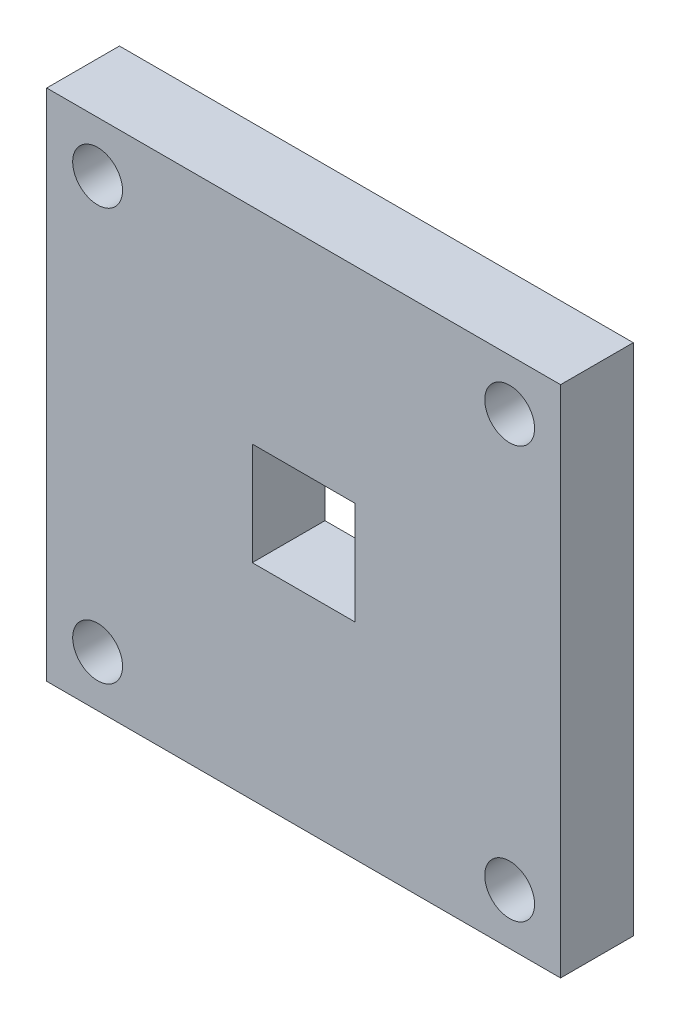
ISO-10303-21;
HEADER;
FILE_DESCRIPTION(('STEP AP214'),'2;1');
FILE_NAME('part.step','',(''),(''),'','','');
FILE_SCHEMA(('AUTOMOTIVE_DESIGN { 1 0 10303 214 1 1 1 1 }'));
ENDSEC;
DATA;
#1=APPLICATION_CONTEXT('core data for automotive mechanical design processes');
#2=APPLICATION_PROTOCOL_DEFINITION('international standard','automotive_design',2000,#1);
#3=PRODUCT_CONTEXT('',#1,'mechanical');
#4=PRODUCT('Part','Part','',(#3));
#5=PRODUCT_RELATED_PRODUCT_CATEGORY('part','',(#4));
#6=PRODUCT_DEFINITION_FORMATION('','',#4);
#7=PRODUCT_DEFINITION_CONTEXT('part definition',#1,'design');
#8=PRODUCT_DEFINITION('design','',#6,#7);
#9=PRODUCT_DEFINITION_SHAPE('','',#8);
#10=(LENGTH_UNIT() NAMED_UNIT(*) SI_UNIT(.MILLI.,.METRE.));
#11=(NAMED_UNIT(*) PLANE_ANGLE_UNIT() SI_UNIT($,.RADIAN.));
#12=(NAMED_UNIT(*) SI_UNIT($,.STERADIAN.) SOLID_ANGLE_UNIT());
#13=UNCERTAINTY_MEASURE_WITH_UNIT(LENGTH_MEASURE(1.E-05),#10,'distance_accuracy_value','');
#14=(GEOMETRIC_REPRESENTATION_CONTEXT(3) GLOBAL_UNCERTAINTY_ASSIGNED_CONTEXT((#13)) GLOBAL_UNIT_ASSIGNED_CONTEXT((#10,
#11,#12)) REPRESENTATION_CONTEXT('',''));
#15=CARTESIAN_POINT('',(0.,0.,0.));
#16=DIRECTION('',(0.,0.,1.));
#17=DIRECTION('',(1.,0.,0.));
#18=AXIS2_PLACEMENT_3D('',#15,#16,#17);
#19=CARTESIAN_POINT('',(16.8275,-16.8275,2.38125));
#20=DIRECTION('',(-1.,0.,0.));
#21=DIRECTION('',(0.,0.,1.));
#22=AXIS2_PLACEMENT_3D('',#19,#20,#21);
#23=PLANE('',#22);
#24=DIRECTION('',(0.,1.,0.));
#25=VECTOR('',#24,1.);
#26=CARTESIAN_POINT('',(16.8275,-16.8275,-2.38125));
#27=LINE('',#26,#25);
#28=CARTESIAN_POINT('',(16.8275,-16.8275,-2.38125));
#29=VERTEX_POINT('',#28);
#30=CARTESIAN_POINT('',(16.8275,16.8275,-2.38125));
#31=VERTEX_POINT('',#30);
#32=EDGE_CURVE('E104',#29,#31,#27,.T.);
#33=ORIENTED_EDGE('',*,*,#32,.T.);
#34=DIRECTION('',(0.,0.,-1.));
#35=VECTOR('',#34,1.);
#36=CARTESIAN_POINT('',(16.8275,16.8275,2.38125));
#37=LINE('',#36,#35);
#38=CARTESIAN_POINT('',(16.8275,16.8275,2.38125));
#39=VERTEX_POINT('',#38);
#40=EDGE_CURVE('E11',#39,#31,#37,.T.);
#41=ORIENTED_EDGE('',*,*,#40,.F.);
#42=DIRECTION('',(0.,1.,0.));
#43=VECTOR('',#42,1.);
#44=CARTESIAN_POINT('',(16.8275,-16.8275,2.38125));
#45=LINE('',#44,#43);
#46=CARTESIAN_POINT('',(16.8275,-16.8275,2.38125));
#47=VERTEX_POINT('',#46);
#48=EDGE_CURVE('E133',#47,#39,#45,.T.);
#49=ORIENTED_EDGE('',*,*,#48,.F.);
#50=DIRECTION('',(0.,0.,-1.));
#51=VECTOR('',#50,1.);
#52=CARTESIAN_POINT('',(16.8275,-16.8275,2.38125));
#53=LINE('',#52,#51);
#54=EDGE_CURVE('E143',#47,#29,#53,.T.);
#55=ORIENTED_EDGE('',*,*,#54,.T.);
#56=EDGE_LOOP('',(#33,#41,#49,#55));
#57=FACE_BOUND('',#56,.T.);
#58=ADVANCED_FACE('F34',(#57),#23,.F.);
#59=CARTESIAN_POINT('',(-16.8275,16.8275,2.38125));
#60=DIRECTION('',(0.,-1.,0.));
#61=DIRECTION('',(0.,0.,-1.));
#62=AXIS2_PLACEMENT_3D('',#59,#60,#61);
#63=PLANE('',#62);
#64=DIRECTION('',(-1.,0.,0.));
#65=VECTOR('',#64,1.);
#66=CARTESIAN_POINT('',(-16.8275,16.8275,-2.38125));
#67=LINE('',#66,#65);
#68=CARTESIAN_POINT('',(-16.8275,16.8275,-2.38125));
#69=VERTEX_POINT('',#68);
#70=EDGE_CURVE('E146',#31,#69,#67,.T.);
#71=ORIENTED_EDGE('',*,*,#70,.T.);
#72=DIRECTION('',(0.,0.,-1.));
#73=VECTOR('',#72,1.);
#74=CARTESIAN_POINT('',(-16.8275,16.8275,2.38125));
#75=LINE('',#74,#73);
#76=CARTESIAN_POINT('',(-16.8275,16.8275,2.38125));
#77=VERTEX_POINT('',#76);
#78=EDGE_CURVE('E41',#77,#69,#75,.T.);
#79=ORIENTED_EDGE('',*,*,#78,.F.);
#80=DIRECTION('',(-1.,0.,0.));
#81=VECTOR('',#80,1.);
#82=CARTESIAN_POINT('',(-16.8275,16.8275,2.38125));
#83=LINE('',#82,#81);
#84=EDGE_CURVE('E136',#39,#77,#83,.T.);
#85=ORIENTED_EDGE('',*,*,#84,.F.);
#86=ORIENTED_EDGE('',*,*,#40,.T.);
#87=EDGE_LOOP('',(#71,#79,#85,#86));
#88=FACE_BOUND('',#87,.T.);
#89=ADVANCED_FACE('F174',(#88),#63,.F.);
#90=CARTESIAN_POINT('',(-16.8275,-16.8275,2.38125));
#91=DIRECTION('',(1.,0.,0.));
#92=DIRECTION('',(0.,0.,-1.));
#93=AXIS2_PLACEMENT_3D('',#90,#91,#92);
#94=PLANE('',#93);
#95=DIRECTION('',(0.,-1.,0.));
#96=VECTOR('',#95,1.);
#97=CARTESIAN_POINT('',(-16.8275,-16.8275,-2.38125));
#98=LINE('',#97,#96);
#99=CARTESIAN_POINT('',(-16.8275,-16.8275,-2.38125));
#100=VERTEX_POINT('',#99);
#101=EDGE_CURVE('E148',#69,#100,#98,.T.);
#102=ORIENTED_EDGE('',*,*,#101,.T.);
#103=DIRECTION('',(0.,0.,-1.));
#104=VECTOR('',#103,1.);
#105=CARTESIAN_POINT('',(-16.8275,-16.8275,2.38125));
#106=LINE('',#105,#104);
#107=CARTESIAN_POINT('',(-16.8275,-16.8275,2.38125));
#108=VERTEX_POINT('',#107);
#109=EDGE_CURVE('E153',#108,#100,#106,.T.);
#110=ORIENTED_EDGE('',*,*,#109,.F.);
#111=DIRECTION('',(0.,-1.,0.));
#112=VECTOR('',#111,1.);
#113=CARTESIAN_POINT('',(-16.8275,-16.8275,2.38125));
#114=LINE('',#113,#112);
#115=EDGE_CURVE('E139',#77,#108,#114,.T.);
#116=ORIENTED_EDGE('',*,*,#115,.F.);
#117=ORIENTED_EDGE('',*,*,#78,.T.);
#118=EDGE_LOOP('',(#102,#110,#116,#117));
#119=FACE_BOUND('',#118,.T.);
#120=ADVANCED_FACE('F160',(#119),#94,.F.);
#121=CARTESIAN_POINT('',(-16.8275,-16.8275,2.38125));
#122=DIRECTION('',(0.,1.,0.));
#123=DIRECTION('',(0.,0.,1.));
#124=AXIS2_PLACEMENT_3D('',#121,#122,#123);
#125=PLANE('',#124);
#126=DIRECTION('',(1.,0.,0.));
#127=VECTOR('',#126,1.);
#128=CARTESIAN_POINT('',(-16.8275,-16.8275,-2.38125));
#129=LINE('',#128,#127);
#130=EDGE_CURVE('E137',#100,#29,#129,.T.);
#131=ORIENTED_EDGE('',*,*,#130,.T.);
#132=ORIENTED_EDGE('',*,*,#54,.F.);
#133=DIRECTION('',(1.,0.,0.));
#134=VECTOR('',#133,1.);
#135=CARTESIAN_POINT('',(-16.8275,-16.8275,2.38125));
#136=LINE('',#135,#134);
#137=EDGE_CURVE('E141',#108,#47,#136,.T.);
#138=ORIENTED_EDGE('',*,*,#137,.F.);
#139=ORIENTED_EDGE('',*,*,#109,.T.);
#140=EDGE_LOOP('',(#131,#132,#138,#139));
#141=FACE_BOUND('',#140,.T.);
#142=ADVANCED_FACE('F167',(#141),#125,.F.);
#143=CARTESIAN_POINT('',(0.,0.,2.38125));
#144=DIRECTION('',(0.,0.,-1.));
#145=DIRECTION('',(-1.,0.,0.));
#146=AXIS2_PLACEMENT_3D('',#143,#144,#145);
#147=PLANE('',#146);
#148=CARTESIAN_POINT('',(-13.49375,13.49375,2.38125));
#149=DIRECTION('',(0.,0.,1.));
#150=DIRECTION('',(1.,0.,0.));
#151=AXIS2_PLACEMENT_3D('',#148,#149,#150);
#152=CIRCLE('',#151,1.63195);
#153=CARTESIAN_POINT('',(-11.8618,13.49375,2.38125));
#154=VERTEX_POINT('',#153);
#155=EDGE_CURVE('E225',#154,#154,#152,.T.);
#156=ORIENTED_EDGE('',*,*,#155,.F.);
#157=EDGE_LOOP('',(#156));
#158=FACE_BOUND('',#157,.T.);
#159=CARTESIAN_POINT('',(13.49375,13.49375,2.38125));
#160=DIRECTION('',(0.,0.,1.));
#161=DIRECTION('',(1.,0.,0.));
#162=AXIS2_PLACEMENT_3D('',#159,#160,#161);
#163=CIRCLE('',#162,1.63195);
#164=CARTESIAN_POINT('',(15.1257,13.49375,2.38125));
#165=VERTEX_POINT('',#164);
#166=EDGE_CURVE('E227',#165,#165,#163,.T.);
#167=ORIENTED_EDGE('',*,*,#166,.F.);
#168=EDGE_LOOP('',(#167));
#169=FACE_BOUND('',#168,.T.);
#170=CARTESIAN_POINT('',(-13.49375,-13.49375,2.38125));
#171=DIRECTION('',(0.,0.,1.));
#172=DIRECTION('',(1.,0.,0.));
#173=AXIS2_PLACEMENT_3D('',#170,#171,#172);
#174=CIRCLE('',#173,1.63195);
#175=CARTESIAN_POINT('',(-11.8618,-13.49375,2.38125));
#176=VERTEX_POINT('',#175);
#177=EDGE_CURVE('E235',#176,#176,#174,.T.);
#178=ORIENTED_EDGE('',*,*,#177,.F.);
#179=EDGE_LOOP('',(#178));
#180=FACE_BOUND('',#179,.T.);
#181=CARTESIAN_POINT('',(13.49375,-13.49375,2.38125));
#182=DIRECTION('',(0.,0.,1.));
#183=DIRECTION('',(1.,0.,0.));
#184=AXIS2_PLACEMENT_3D('',#181,#182,#183);
#185=CIRCLE('',#184,1.63195);
#186=CARTESIAN_POINT('',(15.1257,-13.49375,2.38125));
#187=VERTEX_POINT('',#186);
#188=EDGE_CURVE('E241',#187,#187,#185,.T.);
#189=ORIENTED_EDGE('',*,*,#188,.F.);
#190=EDGE_LOOP('',(#189));
#191=FACE_BOUND('',#190,.T.);
#192=DIRECTION('',(-1.,0.,0.));
#193=VECTOR('',#192,1.);
#194=CARTESIAN_POINT('',(-3.3655,3.3655,2.38125));
#195=LINE('',#194,#193);
#196=CARTESIAN_POINT('',(3.3655,3.3655,2.38125));
#197=VERTEX_POINT('',#196);
#198=CARTESIAN_POINT('',(-3.3655,3.3655,2.38125));
#199=VERTEX_POINT('',#198);
#200=EDGE_CURVE('E117',#197,#199,#195,.T.);
#201=ORIENTED_EDGE('',*,*,#200,.F.);
#202=DIRECTION('',(0.,1.,0.));
#203=VECTOR('',#202,1.);
#204=CARTESIAN_POINT('',(3.3655,-3.3655,2.38125));
#205=LINE('',#204,#203);
#206=CARTESIAN_POINT('',(3.3655,-3.3655,2.38125));
#207=VERTEX_POINT('',#206);
#208=EDGE_CURVE('E48',#207,#197,#205,.T.);
#209=ORIENTED_EDGE('',*,*,#208,.F.);
#210=DIRECTION('',(1.,0.,0.));
#211=VECTOR('',#210,1.);
#212=CARTESIAN_POINT('',(-3.3655,-3.3655,2.38125));
#213=LINE('',#212,#211);
#214=CARTESIAN_POINT('',(-3.3655,-3.3655,2.38125));
#215=VERTEX_POINT('',#214);
#216=EDGE_CURVE('E110',#215,#207,#213,.T.);
#217=ORIENTED_EDGE('',*,*,#216,.F.);
#218=DIRECTION('',(0.,-1.,0.));
#219=VECTOR('',#218,1.);
#220=CARTESIAN_POINT('',(-3.3655,-3.3655,2.38125));
#221=LINE('',#220,#219);
#222=EDGE_CURVE('E124',#199,#215,#221,.T.);
#223=ORIENTED_EDGE('',*,*,#222,.F.);
#224=EDGE_LOOP('',(#201,#209,#217,#223));
#225=FACE_BOUND('',#224,.T.);
#226=ORIENTED_EDGE('',*,*,#48,.T.);
#227=ORIENTED_EDGE('',*,*,#84,.T.);
#228=ORIENTED_EDGE('',*,*,#115,.T.);
#229=ORIENTED_EDGE('',*,*,#137,.T.);
#230=EDGE_LOOP('',(#226,#227,#228,#229));
#231=FACE_BOUND('',#230,.T.);
#232=ADVANCED_FACE('F173',(#158,#169,#180,#191,#225,#231),#147,.F.);
#233=CARTESIAN_POINT('',(0.,0.,-2.38125));
#234=DIRECTION('',(0.,0.,-1.));
#235=DIRECTION('',(-1.,0.,0.));
#236=AXIS2_PLACEMENT_3D('',#233,#234,#235);
#237=PLANE('',#236);
#238=CARTESIAN_POINT('',(-13.49375,13.49375,-2.38125));
#239=DIRECTION('',(0.,0.,-1.));
#240=DIRECTION('',(-1.,0.,0.));
#241=AXIS2_PLACEMENT_3D('',#238,#239,#240);
#242=CIRCLE('',#241,1.63195);
#243=CARTESIAN_POINT('',(-15.1257,13.49375,-2.38125));
#244=VERTEX_POINT('',#243);
#245=EDGE_CURVE('E222',#244,#244,#242,.T.);
#246=ORIENTED_EDGE('',*,*,#245,.F.);
#247=EDGE_LOOP('',(#246));
#248=FACE_BOUND('',#247,.T.);
#249=CARTESIAN_POINT('',(13.49375,13.49375,-2.38125));
#250=DIRECTION('',(0.,0.,-1.));
#251=DIRECTION('',(-1.,0.,0.));
#252=AXIS2_PLACEMENT_3D('',#249,#250,#251);
#253=CIRCLE('',#252,1.63195);
#254=CARTESIAN_POINT('',(11.8618,13.49375,-2.38125));
#255=VERTEX_POINT('',#254);
#256=EDGE_CURVE('E232',#255,#255,#253,.T.);
#257=ORIENTED_EDGE('',*,*,#256,.F.);
#258=EDGE_LOOP('',(#257));
#259=FACE_BOUND('',#258,.T.);
#260=CARTESIAN_POINT('',(-13.49375,-13.49375,-2.38125));
#261=DIRECTION('',(0.,0.,-1.));
#262=DIRECTION('',(-1.,0.,0.));
#263=AXIS2_PLACEMENT_3D('',#260,#261,#262);
#264=CIRCLE('',#263,1.63195);
#265=CARTESIAN_POINT('',(-15.1257,-13.49375,-2.38125));
#266=VERTEX_POINT('',#265);
#267=EDGE_CURVE('E238',#266,#266,#264,.T.);
#268=ORIENTED_EDGE('',*,*,#267,.F.);
#269=EDGE_LOOP('',(#268));
#270=FACE_BOUND('',#269,.T.);
#271=CARTESIAN_POINT('',(13.49375,-13.49375,-2.38125));
#272=DIRECTION('',(0.,0.,-1.));
#273=DIRECTION('',(-1.,0.,0.));
#274=AXIS2_PLACEMENT_3D('',#271,#272,#273);
#275=CIRCLE('',#274,1.63195);
#276=CARTESIAN_POINT('',(11.8618,-13.49375,-2.38125));
#277=VERTEX_POINT('',#276);
#278=EDGE_CURVE('E244',#277,#277,#275,.T.);
#279=ORIENTED_EDGE('',*,*,#278,.F.);
#280=EDGE_LOOP('',(#279));
#281=FACE_BOUND('',#280,.T.);
#282=DIRECTION('',(0.,1.,0.));
#283=VECTOR('',#282,1.);
#284=CARTESIAN_POINT('',(3.3655,-3.3655,-2.38125));
#285=LINE('',#284,#283);
#286=CARTESIAN_POINT('',(3.3655,-3.3655,-2.38125));
#287=VERTEX_POINT('',#286);
#288=CARTESIAN_POINT('',(3.3655,3.3655,-2.38125));
#289=VERTEX_POINT('',#288);
#290=EDGE_CURVE('E108',#287,#289,#285,.T.);
#291=ORIENTED_EDGE('',*,*,#290,.T.);
#292=DIRECTION('',(-1.,0.,0.));
#293=VECTOR('',#292,1.);
#294=CARTESIAN_POINT('',(-3.3655,3.3655,-2.38125));
#295=LINE('',#294,#293);
#296=CARTESIAN_POINT('',(-3.3655,3.3655,-2.38125));
#297=VERTEX_POINT('',#296);
#298=EDGE_CURVE('E97',#289,#297,#295,.T.);
#299=ORIENTED_EDGE('',*,*,#298,.T.);
#300=DIRECTION('',(0.,-1.,0.));
#301=VECTOR('',#300,1.);
#302=CARTESIAN_POINT('',(-3.3655,-3.3655,-2.38125));
#303=LINE('',#302,#301);
#304=CARTESIAN_POINT('',(-3.3655,-3.3655,-2.38125));
#305=VERTEX_POINT('',#304);
#306=EDGE_CURVE('E119',#297,#305,#303,.T.);
#307=ORIENTED_EDGE('',*,*,#306,.T.);
#308=DIRECTION('',(1.,0.,0.));
#309=VECTOR('',#308,1.);
#310=CARTESIAN_POINT('',(-3.3655,-3.3655,-2.38125));
#311=LINE('',#310,#309);
#312=EDGE_CURVE('E115',#305,#287,#311,.T.);
#313=ORIENTED_EDGE('',*,*,#312,.T.);
#314=EDGE_LOOP('',(#291,#299,#307,#313));
#315=FACE_BOUND('',#314,.T.);
#316=ORIENTED_EDGE('',*,*,#32,.F.);
#317=ORIENTED_EDGE('',*,*,#130,.F.);
#318=ORIENTED_EDGE('',*,*,#101,.F.);
#319=ORIENTED_EDGE('',*,*,#70,.F.);
#320=EDGE_LOOP('',(#316,#317,#318,#319));
#321=FACE_BOUND('',#320,.T.);
#322=ADVANCED_FACE('F113',(#248,#259,#270,#281,#315,#321),#237,.T.);
#323=CARTESIAN_POINT('',(3.3655,-3.3655,-2.38225));
#324=DIRECTION('',(1.,0.,0.));
#325=DIRECTION('',(0.,0.,-1.));
#326=AXIS2_PLACEMENT_3D('',#323,#324,#325);
#327=PLANE('',#326);
#328=DIRECTION('',(0.,0.,1.));
#329=VECTOR('',#328,1.);
#330=CARTESIAN_POINT('',(3.3655,-3.3655,-2.38225));
#331=LINE('',#330,#329);
#332=EDGE_CURVE('E105',#287,#207,#331,.T.);
#333=ORIENTED_EDGE('',*,*,#332,.T.);
#334=ORIENTED_EDGE('',*,*,#208,.T.);
#335=DIRECTION('',(0.,0.,1.));
#336=VECTOR('',#335,1.);
#337=CARTESIAN_POINT('',(3.3655,3.3655,-2.38225));
#338=LINE('',#337,#336);
#339=EDGE_CURVE('E99',#289,#197,#338,.T.);
#340=ORIENTED_EDGE('',*,*,#339,.F.);
#341=ORIENTED_EDGE('',*,*,#290,.F.);
#342=EDGE_LOOP('',(#333,#334,#340,#341));
#343=FACE_BOUND('',#342,.T.);
#344=ADVANCED_FACE('F107',(#343),#327,.F.);
#345=CARTESIAN_POINT('',(-3.3655,-3.3655,-2.38225));
#346=DIRECTION('',(0.,-1.,0.));
#347=DIRECTION('',(0.,0.,-1.));
#348=AXIS2_PLACEMENT_3D('',#345,#346,#347);
#349=PLANE('',#348);
#350=DIRECTION('',(0.,0.,1.));
#351=VECTOR('',#350,1.);
#352=CARTESIAN_POINT('',(-3.3655,-3.3655,-2.38225));
#353=LINE('',#352,#351);
#354=EDGE_CURVE('E130',#305,#215,#353,.T.);
#355=ORIENTED_EDGE('',*,*,#354,.T.);
#356=ORIENTED_EDGE('',*,*,#216,.T.);
#357=ORIENTED_EDGE('',*,*,#332,.F.);
#358=ORIENTED_EDGE('',*,*,#312,.F.);
#359=EDGE_LOOP('',(#355,#356,#357,#358));
#360=FACE_BOUND('',#359,.T.);
#361=ADVANCED_FACE('F192',(#360),#349,.F.);
#362=CARTESIAN_POINT('',(-3.3655,-3.3655,-2.38225));
#363=DIRECTION('',(-1.,0.,0.));
#364=DIRECTION('',(0.,0.,1.));
#365=AXIS2_PLACEMENT_3D('',#362,#363,#364);
#366=PLANE('',#365);
#367=DIRECTION('',(0.,0.,1.));
#368=VECTOR('',#367,1.);
#369=CARTESIAN_POINT('',(-3.3655,3.3655,-2.38225));
#370=LINE('',#369,#368);
#371=EDGE_CURVE('E56',#297,#199,#370,.T.);
#372=ORIENTED_EDGE('',*,*,#371,.T.);
#373=ORIENTED_EDGE('',*,*,#222,.T.);
#374=ORIENTED_EDGE('',*,*,#354,.F.);
#375=ORIENTED_EDGE('',*,*,#306,.F.);
#376=EDGE_LOOP('',(#372,#373,#374,#375));
#377=FACE_BOUND('',#376,.T.);
#378=ADVANCED_FACE('F196',(#377),#366,.F.);
#379=CARTESIAN_POINT('',(-3.3655,3.3655,-2.38225));
#380=DIRECTION('',(0.,1.,0.));
#381=DIRECTION('',(0.,0.,1.));
#382=AXIS2_PLACEMENT_3D('',#379,#380,#381);
#383=PLANE('',#382);
#384=ORIENTED_EDGE('',*,*,#339,.T.);
#385=ORIENTED_EDGE('',*,*,#200,.T.);
#386=ORIENTED_EDGE('',*,*,#371,.F.);
#387=ORIENTED_EDGE('',*,*,#298,.F.);
#388=EDGE_LOOP('',(#384,#385,#386,#387));
#389=FACE_BOUND('',#388,.T.);
#390=ADVANCED_FACE('F98',(#389),#383,.F.);
#391=CARTESIAN_POINT('',(13.49375,-13.49375,2.38125));
#392=DIRECTION('',(0.,0.,1.));
#393=DIRECTION('',(1.,0.,0.));
#394=AXIS2_PLACEMENT_3D('',#391,#392,#393);
#395=CYLINDRICAL_SURFACE('',#394,1.63195);
#396=ORIENTED_EDGE('',*,*,#278,.T.);
#397=EDGE_LOOP('',(#396));
#398=FACE_BOUND('',#397,.T.);
#399=ORIENTED_EDGE('',*,*,#188,.T.);
#400=EDGE_LOOP('',(#399));
#401=FACE_BOUND('',#400,.T.);
#402=ADVANCED_FACE('F195',(#398,#401),#395,.F.);
#403=CARTESIAN_POINT('',(-13.49375,-13.49375,2.38125));
#404=DIRECTION('',(0.,0.,1.));
#405=DIRECTION('',(1.,0.,0.));
#406=AXIS2_PLACEMENT_3D('',#403,#404,#405);
#407=CYLINDRICAL_SURFACE('',#406,1.63195);
#408=ORIENTED_EDGE('',*,*,#267,.T.);
#409=EDGE_LOOP('',(#408));
#410=FACE_BOUND('',#409,.T.);
#411=ORIENTED_EDGE('',*,*,#177,.T.);
#412=EDGE_LOOP('',(#411));
#413=FACE_BOUND('',#412,.T.);
#414=ADVANCED_FACE('F205',(#410,#413),#407,.F.);
#415=CARTESIAN_POINT('',(13.49375,13.49375,2.38125));
#416=DIRECTION('',(0.,0.,1.));
#417=DIRECTION('',(1.,0.,0.));
#418=AXIS2_PLACEMENT_3D('',#415,#416,#417);
#419=CYLINDRICAL_SURFACE('',#418,1.63195);
#420=ORIENTED_EDGE('',*,*,#256,.T.);
#421=EDGE_LOOP('',(#420));
#422=FACE_BOUND('',#421,.T.);
#423=ORIENTED_EDGE('',*,*,#166,.T.);
#424=EDGE_LOOP('',(#423));
#425=FACE_BOUND('',#424,.T.);
#426=ADVANCED_FACE('F209',(#422,#425),#419,.F.);
#427=CARTESIAN_POINT('',(-13.49375,13.49375,2.38125));
#428=DIRECTION('',(0.,0.,1.));
#429=DIRECTION('',(1.,0.,0.));
#430=AXIS2_PLACEMENT_3D('',#427,#428,#429);
#431=CYLINDRICAL_SURFACE('',#430,1.63195);
#432=ORIENTED_EDGE('',*,*,#245,.T.);
#433=EDGE_LOOP('',(#432));
#434=FACE_BOUND('',#433,.T.);
#435=ORIENTED_EDGE('',*,*,#155,.T.);
#436=EDGE_LOOP('',(#435));
#437=FACE_BOUND('',#436,.T.);
#438=ADVANCED_FACE('F213',(#434,#437),#431,.F.);
#439=CLOSED_SHELL('',(#58,#89,#120,#142,#232,#322,#344,#361,#378,#390,#402,#414,#426,#438));
#440=MANIFOLD_SOLID_BREP('B2',#439);
#441=ADVANCED_BREP_SHAPE_REPRESENTATION('',(#18,#440),#14);
#442=SHAPE_DEFINITION_REPRESENTATION(#9,#441);
ENDSEC;
END-ISO-10303-21;
